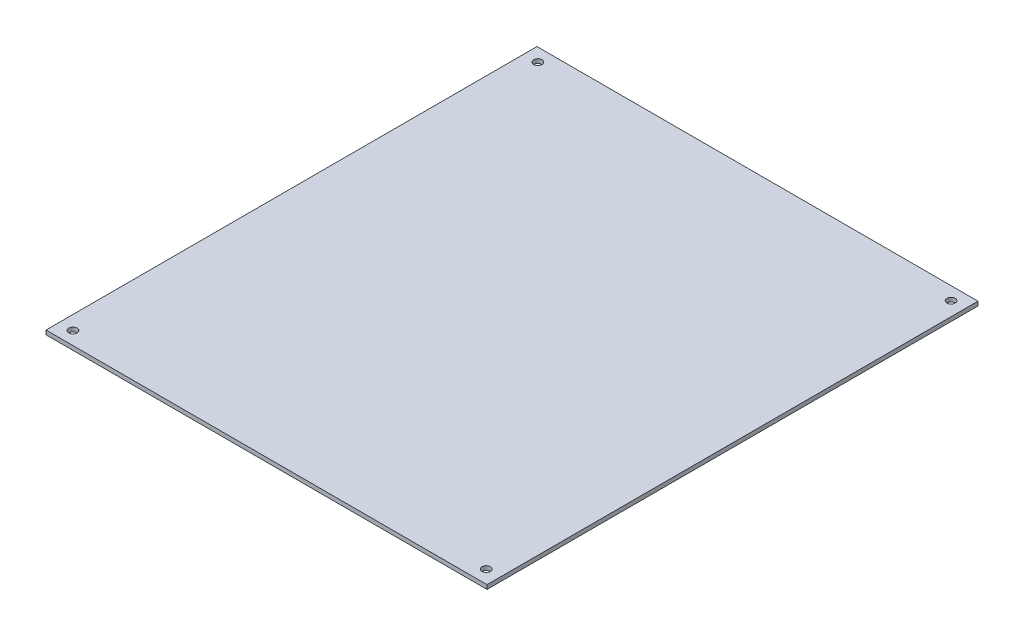
ISO-10303-21;
HEADER;
FILE_DESCRIPTION(('STEP AP214'),'2;1');
FILE_NAME('part.step','',(''),(''),'','','');
FILE_SCHEMA(('AUTOMOTIVE_DESIGN { 1 0 10303 214 1 1 1 1 }'));
ENDSEC;
DATA;
#1=APPLICATION_CONTEXT('core data for automotive mechanical design processes');
#2=APPLICATION_PROTOCOL_DEFINITION('international standard','automotive_design',2000,#1);
#3=PRODUCT_CONTEXT('',#1,'mechanical');
#4=PRODUCT('Part','Part','',(#3));
#5=PRODUCT_RELATED_PRODUCT_CATEGORY('part','',(#4));
#6=PRODUCT_DEFINITION_FORMATION('','',#4);
#7=PRODUCT_DEFINITION_CONTEXT('part definition',#1,'design');
#8=PRODUCT_DEFINITION('design','',#6,#7);
#9=PRODUCT_DEFINITION_SHAPE('','',#8);
#10=(LENGTH_UNIT() NAMED_UNIT(*) SI_UNIT(.MILLI.,.METRE.));
#11=(NAMED_UNIT(*) PLANE_ANGLE_UNIT() SI_UNIT($,.RADIAN.));
#12=(NAMED_UNIT(*) SI_UNIT($,.STERADIAN.) SOLID_ANGLE_UNIT());
#13=UNCERTAINTY_MEASURE_WITH_UNIT(LENGTH_MEASURE(1.E-05),#10,'distance_accuracy_value','');
#14=(GEOMETRIC_REPRESENTATION_CONTEXT(3) GLOBAL_UNCERTAINTY_ASSIGNED_CONTEXT((#13)) GLOBAL_UNIT_ASSIGNED_CONTEXT((#10,
#11,#12)) REPRESENTATION_CONTEXT('',''));
#15=CARTESIAN_POINT('',(0.,0.,0.));
#16=DIRECTION('',(0.,0.,1.));
#17=DIRECTION('',(1.,0.,0.));
#18=AXIS2_PLACEMENT_3D('',#15,#16,#17);
#19=CARTESIAN_POINT('',(106.,2.,118.));
#20=DIRECTION('',(-1.,0.,0.));
#21=DIRECTION('',(0.,0.,1.));
#22=AXIS2_PLACEMENT_3D('',#19,#20,#21);
#23=PLANE('',#22);
#24=DIRECTION('',(0.,0.,-1.));
#25=VECTOR('',#24,1.);
#26=CARTESIAN_POINT('',(106.,0.,118.));
#27=LINE('',#26,#25);
#28=CARTESIAN_POINT('',(106.,0.,118.));
#29=VERTEX_POINT('',#28);
#30=CARTESIAN_POINT('',(106.,0.,-118.));
#31=VERTEX_POINT('',#30);
#32=EDGE_CURVE('E96',#29,#31,#27,.T.);
#33=ORIENTED_EDGE('',*,*,#32,.T.);
#34=DIRECTION('',(0.,-1.,0.));
#35=VECTOR('',#34,1.);
#36=CARTESIAN_POINT('',(106.,2.,-118.));
#37=LINE('',#36,#35);
#38=CARTESIAN_POINT('',(106.,2.,-118.));
#39=VERTEX_POINT('',#38);
#40=EDGE_CURVE('E11',#39,#31,#37,.T.);
#41=ORIENTED_EDGE('',*,*,#40,.F.);
#42=DIRECTION('',(0.,0.,-1.));
#43=VECTOR('',#42,1.);
#44=CARTESIAN_POINT('',(106.,2.,118.));
#45=LINE('',#44,#43);
#46=CARTESIAN_POINT('',(106.,2.,118.));
#47=VERTEX_POINT('',#46);
#48=EDGE_CURVE('E84',#47,#39,#45,.T.);
#49=ORIENTED_EDGE('',*,*,#48,.F.);
#50=DIRECTION('',(0.,-1.,0.));
#51=VECTOR('',#50,1.);
#52=CARTESIAN_POINT('',(106.,2.,118.));
#53=LINE('',#52,#51);
#54=EDGE_CURVE('E92',#47,#29,#53,.T.);
#55=ORIENTED_EDGE('',*,*,#54,.T.);
#56=EDGE_LOOP('',(#33,#41,#49,#55));
#57=FACE_BOUND('',#56,.T.);
#58=ADVANCED_FACE('F33',(#57),#23,.F.);
#59=CARTESIAN_POINT('',(-106.,2.,-118.));
#60=DIRECTION('',(0.,0.,1.));
#61=DIRECTION('',(1.,0.,0.));
#62=AXIS2_PLACEMENT_3D('',#59,#60,#61);
#63=PLANE('',#62);
#64=DIRECTION('',(-1.,0.,0.));
#65=VECTOR('',#64,1.);
#66=CARTESIAN_POINT('',(-106.,0.,-118.));
#67=LINE('',#66,#65);
#68=CARTESIAN_POINT('',(-106.,0.,-118.));
#69=VERTEX_POINT('',#68);
#70=EDGE_CURVE('E88',#31,#69,#67,.T.);
#71=ORIENTED_EDGE('',*,*,#70,.T.);
#72=DIRECTION('',(0.,-1.,0.));
#73=VECTOR('',#72,1.);
#74=CARTESIAN_POINT('',(-106.,2.,-118.));
#75=LINE('',#74,#73);
#76=CARTESIAN_POINT('',(-106.,2.,-118.));
#77=VERTEX_POINT('',#76);
#78=EDGE_CURVE('E41',#77,#69,#75,.T.);
#79=ORIENTED_EDGE('',*,*,#78,.F.);
#80=DIRECTION('',(-1.,0.,0.));
#81=VECTOR('',#80,1.);
#82=CARTESIAN_POINT('',(-106.,2.,-118.));
#83=LINE('',#82,#81);
#84=EDGE_CURVE('E79',#39,#77,#83,.T.);
#85=ORIENTED_EDGE('',*,*,#84,.F.);
#86=ORIENTED_EDGE('',*,*,#40,.T.);
#87=EDGE_LOOP('',(#71,#79,#85,#86));
#88=FACE_BOUND('',#87,.T.);
#89=ADVANCED_FACE('F87',(#88),#63,.F.);
#90=CARTESIAN_POINT('',(-106.,2.,118.));
#91=DIRECTION('',(1.,0.,0.));
#92=DIRECTION('',(0.,0.,-1.));
#93=AXIS2_PLACEMENT_3D('',#90,#91,#92);
#94=PLANE('',#93);
#95=DIRECTION('',(0.,0.,1.));
#96=VECTOR('',#95,1.);
#97=CARTESIAN_POINT('',(-106.,0.,118.));
#98=LINE('',#97,#96);
#99=CARTESIAN_POINT('',(-106.,0.,118.));
#100=VERTEX_POINT('',#99);
#101=EDGE_CURVE('E66',#69,#100,#98,.T.);
#102=ORIENTED_EDGE('',*,*,#101,.T.);
#103=DIRECTION('',(0.,-1.,0.));
#104=VECTOR('',#103,1.);
#105=CARTESIAN_POINT('',(-106.,2.,118.));
#106=LINE('',#105,#104);
#107=CARTESIAN_POINT('',(-106.,2.,118.));
#108=VERTEX_POINT('',#107);
#109=EDGE_CURVE('E89',#108,#100,#106,.T.);
#110=ORIENTED_EDGE('',*,*,#109,.F.);
#111=DIRECTION('',(0.,0.,1.));
#112=VECTOR('',#111,1.);
#113=CARTESIAN_POINT('',(-106.,2.,118.));
#114=LINE('',#113,#112);
#115=EDGE_CURVE('E82',#77,#108,#114,.T.);
#116=ORIENTED_EDGE('',*,*,#115,.F.);
#117=ORIENTED_EDGE('',*,*,#78,.T.);
#118=EDGE_LOOP('',(#102,#110,#116,#117));
#119=FACE_BOUND('',#118,.T.);
#120=ADVANCED_FACE('F90',(#119),#94,.F.);
#121=CARTESIAN_POINT('',(-106.,2.,118.));
#122=DIRECTION('',(0.,0.,-1.));
#123=DIRECTION('',(-1.,0.,0.));
#124=AXIS2_PLACEMENT_3D('',#121,#122,#123);
#125=PLANE('',#124);
#126=DIRECTION('',(1.,0.,0.));
#127=VECTOR('',#126,1.);
#128=CARTESIAN_POINT('',(-106.,0.,118.));
#129=LINE('',#128,#127);
#130=EDGE_CURVE('E72',#100,#29,#129,.T.);
#131=ORIENTED_EDGE('',*,*,#130,.T.);
#132=ORIENTED_EDGE('',*,*,#54,.F.);
#133=DIRECTION('',(1.,0.,0.));
#134=VECTOR('',#133,1.);
#135=CARTESIAN_POINT('',(-106.,2.,118.));
#136=LINE('',#135,#134);
#137=EDGE_CURVE('E49',#108,#47,#136,.T.);
#138=ORIENTED_EDGE('',*,*,#137,.F.);
#139=ORIENTED_EDGE('',*,*,#109,.T.);
#140=EDGE_LOOP('',(#131,#132,#138,#139));
#141=FACE_BOUND('',#140,.T.);
#142=ADVANCED_FACE('F104',(#141),#125,.F.);
#143=CARTESIAN_POINT('',(0.,2.,0.));
#144=DIRECTION('',(0.,-1.,0.));
#145=DIRECTION('',(0.,0.,-1.));
#146=AXIS2_PLACEMENT_3D('',#143,#144,#145);
#147=PLANE('',#146);
#148=CARTESIAN_POINT('',(99.3218191941496,2.,111.737046593418));
#149=DIRECTION('',(0.,1.,0.));
#150=DIRECTION('',(0.,0.,1.));
#151=AXIS2_PLACEMENT_3D('',#148,#149,#150);
#152=CIRCLE('',#151,2.);
#153=CARTESIAN_POINT('',(99.3218191941496,2.,113.737046593418));
#154=VERTEX_POINT('',#153);
#155=EDGE_CURVE('E128',#154,#154,#152,.T.);
#156=ORIENTED_EDGE('',*,*,#155,.F.);
#157=EDGE_LOOP('',(#156));
#158=FACE_BOUND('',#157,.T.);
#159=CARTESIAN_POINT('',(-99.3218191941496,2.,111.737046593418));
#160=DIRECTION('',(0.,1.,0.));
#161=DIRECTION('',(0.,0.,1.));
#162=AXIS2_PLACEMENT_3D('',#159,#160,#161);
#163=CIRCLE('',#162,2.);
#164=CARTESIAN_POINT('',(-99.3218191941496,2.,113.737046593418));
#165=VERTEX_POINT('',#164);
#166=EDGE_CURVE('E122',#165,#165,#163,.T.);
#167=ORIENTED_EDGE('',*,*,#166,.F.);
#168=EDGE_LOOP('',(#167));
#169=FACE_BOUND('',#168,.T.);
#170=CARTESIAN_POINT('',(-99.3218191941496,2.,-111.737046593418));
#171=DIRECTION('',(0.,1.,0.));
#172=DIRECTION('',(0.,0.,1.));
#173=AXIS2_PLACEMENT_3D('',#170,#171,#172);
#174=CIRCLE('',#173,2.);
#175=CARTESIAN_POINT('',(-99.3218191941496,2.,-109.737046593418));
#176=VERTEX_POINT('',#175);
#177=EDGE_CURVE('E116',#176,#176,#174,.T.);
#178=ORIENTED_EDGE('',*,*,#177,.F.);
#179=EDGE_LOOP('',(#178));
#180=FACE_BOUND('',#179,.T.);
#181=CARTESIAN_POINT('',(99.3218191941496,2.,-111.737046593418));
#182=DIRECTION('',(0.,1.,0.));
#183=DIRECTION('',(0.,0.,1.));
#184=AXIS2_PLACEMENT_3D('',#181,#182,#183);
#185=CIRCLE('',#184,2.);
#186=CARTESIAN_POINT('',(99.3218191941496,2.,-109.737046593418));
#187=VERTEX_POINT('',#186);
#188=EDGE_CURVE('E110',#187,#187,#185,.T.);
#189=ORIENTED_EDGE('',*,*,#188,.F.);
#190=EDGE_LOOP('',(#189));
#191=FACE_BOUND('',#190,.T.);
#192=ORIENTED_EDGE('',*,*,#48,.T.);
#193=ORIENTED_EDGE('',*,*,#84,.T.);
#194=ORIENTED_EDGE('',*,*,#115,.T.);
#195=ORIENTED_EDGE('',*,*,#137,.T.);
#196=EDGE_LOOP('',(#192,#193,#194,#195));
#197=FACE_BOUND('',#196,.T.);
#198=ADVANCED_FACE('F80',(#158,#169,#180,#191,#197),#147,.F.);
#199=CARTESIAN_POINT('',(0.,0.,0.));
#200=DIRECTION('',(0.,-1.,0.));
#201=DIRECTION('',(0.,0.,-1.));
#202=AXIS2_PLACEMENT_3D('',#199,#200,#201);
#203=PLANE('',#202);
#204=CARTESIAN_POINT('',(99.3218191941496,0.,111.737046593418));
#205=DIRECTION('',(0.,1.,0.));
#206=DIRECTION('',(0.,0.,1.));
#207=AXIS2_PLACEMENT_3D('',#204,#205,#206);
#208=CIRCLE('',#207,2.);
#209=CARTESIAN_POINT('',(99.3218191941496,0.,113.737046593418));
#210=VERTEX_POINT('',#209);
#211=EDGE_CURVE('E125',#210,#210,#208,.T.);
#212=ORIENTED_EDGE('',*,*,#211,.T.);
#213=EDGE_LOOP('',(#212));
#214=FACE_BOUND('',#213,.T.);
#215=CARTESIAN_POINT('',(-99.3218191941496,0.,111.737046593418));
#216=DIRECTION('',(0.,1.,0.));
#217=DIRECTION('',(0.,0.,1.));
#218=AXIS2_PLACEMENT_3D('',#215,#216,#217);
#219=CIRCLE('',#218,2.);
#220=CARTESIAN_POINT('',(-99.3218191941496,0.,113.737046593418));
#221=VERTEX_POINT('',#220);
#222=EDGE_CURVE('E119',#221,#221,#219,.T.);
#223=ORIENTED_EDGE('',*,*,#222,.T.);
#224=EDGE_LOOP('',(#223));
#225=FACE_BOUND('',#224,.T.);
#226=CARTESIAN_POINT('',(-99.3218191941496,0.,-111.737046593418));
#227=DIRECTION('',(0.,1.,0.));
#228=DIRECTION('',(0.,0.,1.));
#229=AXIS2_PLACEMENT_3D('',#226,#227,#228);
#230=CIRCLE('',#229,2.);
#231=CARTESIAN_POINT('',(-99.3218191941496,0.,-109.737046593418));
#232=VERTEX_POINT('',#231);
#233=EDGE_CURVE('E113',#232,#232,#230,.T.);
#234=ORIENTED_EDGE('',*,*,#233,.T.);
#235=EDGE_LOOP('',(#234));
#236=FACE_BOUND('',#235,.T.);
#237=CARTESIAN_POINT('',(99.3218191941496,0.,-111.737046593418));
#238=DIRECTION('',(0.,1.,0.));
#239=DIRECTION('',(0.,0.,1.));
#240=AXIS2_PLACEMENT_3D('',#237,#238,#239);
#241=CIRCLE('',#240,2.);
#242=CARTESIAN_POINT('',(99.3218191941496,0.,-109.737046593418));
#243=VERTEX_POINT('',#242);
#244=EDGE_CURVE('E99',#243,#243,#241,.T.);
#245=ORIENTED_EDGE('',*,*,#244,.T.);
#246=EDGE_LOOP('',(#245));
#247=FACE_BOUND('',#246,.T.);
#248=ORIENTED_EDGE('',*,*,#32,.F.);
#249=ORIENTED_EDGE('',*,*,#130,.F.);
#250=ORIENTED_EDGE('',*,*,#101,.F.);
#251=ORIENTED_EDGE('',*,*,#70,.F.);
#252=EDGE_LOOP('',(#248,#249,#250,#251));
#253=FACE_BOUND('',#252,.T.);
#254=ADVANCED_FACE('F107',(#214,#225,#236,#247,#253),#203,.T.);
#255=CARTESIAN_POINT('',(99.3218191941496,0.,-111.737046593418));
#256=DIRECTION('',(0.,1.,0.));
#257=DIRECTION('',(0.,0.,1.));
#258=AXIS2_PLACEMENT_3D('',#255,#256,#257);
#259=CYLINDRICAL_SURFACE('',#258,2.);
#260=ORIENTED_EDGE('',*,*,#244,.F.);
#261=EDGE_LOOP('',(#260));
#262=FACE_BOUND('',#261,.T.);
#263=ORIENTED_EDGE('',*,*,#188,.T.);
#264=EDGE_LOOP('',(#263));
#265=FACE_BOUND('',#264,.T.);
#266=ADVANCED_FACE('F152',(#262,#265),#259,.F.);
#267=CARTESIAN_POINT('',(-99.3218191941496,0.,-111.737046593418));
#268=DIRECTION('',(0.,1.,0.));
#269=DIRECTION('',(0.,0.,1.));
#270=AXIS2_PLACEMENT_3D('',#267,#268,#269);
#271=CYLINDRICAL_SURFACE('',#270,2.);
#272=ORIENTED_EDGE('',*,*,#233,.F.);
#273=EDGE_LOOP('',(#272));
#274=FACE_BOUND('',#273,.T.);
#275=ORIENTED_EDGE('',*,*,#177,.T.);
#276=EDGE_LOOP('',(#275));
#277=FACE_BOUND('',#276,.T.);
#278=ADVANCED_FACE('F154',(#274,#277),#271,.F.);
#279=CARTESIAN_POINT('',(-99.3218191941496,0.,111.737046593418));
#280=DIRECTION('',(0.,1.,0.));
#281=DIRECTION('',(0.,0.,1.));
#282=AXIS2_PLACEMENT_3D('',#279,#280,#281);
#283=CYLINDRICAL_SURFACE('',#282,2.);
#284=ORIENTED_EDGE('',*,*,#222,.F.);
#285=EDGE_LOOP('',(#284));
#286=FACE_BOUND('',#285,.T.);
#287=ORIENTED_EDGE('',*,*,#166,.T.);
#288=EDGE_LOOP('',(#287));
#289=FACE_BOUND('',#288,.T.);
#290=ADVANCED_FACE('F139',(#286,#289),#283,.F.);
#291=CARTESIAN_POINT('',(99.3218191941496,0.,111.737046593418));
#292=DIRECTION('',(0.,1.,0.));
#293=DIRECTION('',(0.,0.,1.));
#294=AXIS2_PLACEMENT_3D('',#291,#292,#293);
#295=CYLINDRICAL_SURFACE('',#294,2.);
#296=ORIENTED_EDGE('',*,*,#211,.F.);
#297=EDGE_LOOP('',(#296));
#298=FACE_BOUND('',#297,.T.);
#299=ORIENTED_EDGE('',*,*,#155,.T.);
#300=EDGE_LOOP('',(#299));
#301=FACE_BOUND('',#300,.T.);
#302=ADVANCED_FACE('F136',(#298,#301),#295,.F.);
#303=CLOSED_SHELL('',(#58,#89,#120,#142,#198,#254,#266,#278,#290,#302));
#304=MANIFOLD_SOLID_BREP('B2',#303);
#305=ADVANCED_BREP_SHAPE_REPRESENTATION('',(#18,#304),#14);
#306=SHAPE_DEFINITION_REPRESENTATION(#9,#305);
ENDSEC;
END-ISO-10303-21;
